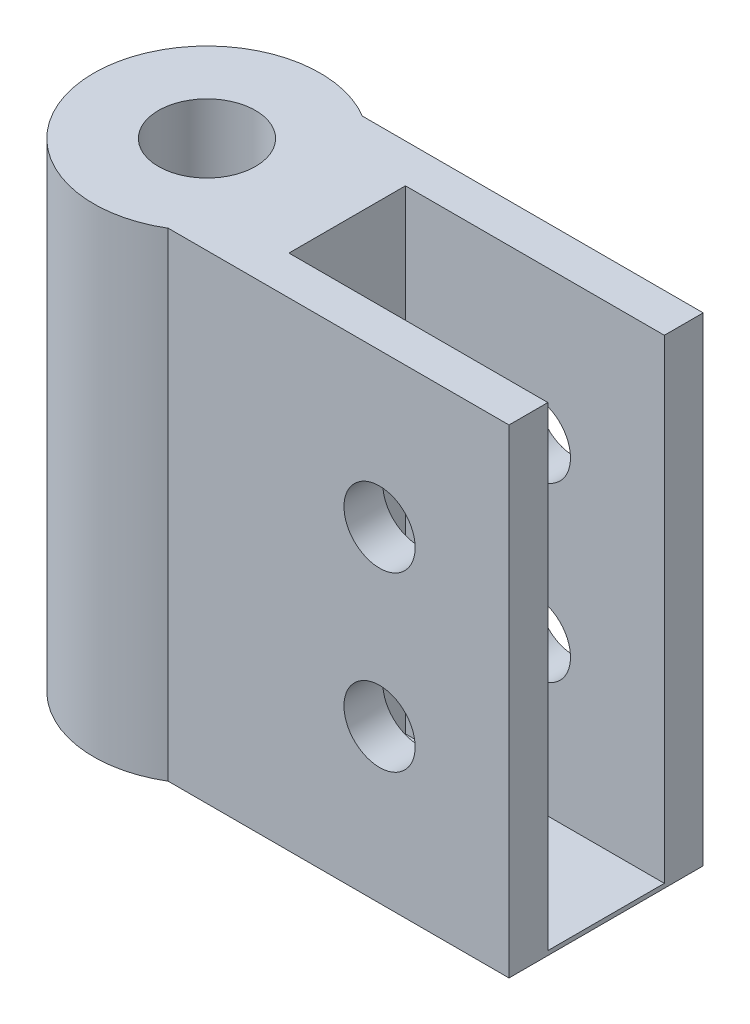
ISO-10303-21;
HEADER;
FILE_DESCRIPTION(('STEP AP214'),'2;1');
FILE_NAME('part.step','',(''),(''),'','','');
FILE_SCHEMA(('AUTOMOTIVE_DESIGN { 1 0 10303 214 1 1 1 1 }'));
ENDSEC;
DATA;
#1=APPLICATION_CONTEXT('core data for automotive mechanical design processes');
#2=APPLICATION_PROTOCOL_DEFINITION('international standard','automotive_design',2000,#1);
#3=PRODUCT_CONTEXT('',#1,'mechanical');
#4=PRODUCT('Part','Part','',(#3));
#5=PRODUCT_RELATED_PRODUCT_CATEGORY('part','',(#4));
#6=PRODUCT_DEFINITION_FORMATION('','',#4);
#7=PRODUCT_DEFINITION_CONTEXT('part definition',#1,'design');
#8=PRODUCT_DEFINITION('design','',#6,#7);
#9=PRODUCT_DEFINITION_SHAPE('','',#8);
#10=(LENGTH_UNIT() NAMED_UNIT(*) SI_UNIT(.MILLI.,.METRE.));
#11=(NAMED_UNIT(*) PLANE_ANGLE_UNIT() SI_UNIT($,.RADIAN.));
#12=(NAMED_UNIT(*) SI_UNIT($,.STERADIAN.) SOLID_ANGLE_UNIT());
#13=UNCERTAINTY_MEASURE_WITH_UNIT(LENGTH_MEASURE(1.E-05),#10,'distance_accuracy_value','');
#14=(GEOMETRIC_REPRESENTATION_CONTEXT(3) GLOBAL_UNCERTAINTY_ASSIGNED_CONTEXT((#13)) GLOBAL_UNIT_ASSIGNED_CONTEXT((#10,
#11,#12)) REPRESENTATION_CONTEXT('',''));
#15=CARTESIAN_POINT('',(0.,0.,0.));
#16=DIRECTION('',(0.,0.,1.));
#17=DIRECTION('',(1.,0.,0.));
#18=AXIS2_PLACEMENT_3D('',#15,#16,#17);
#19=CARTESIAN_POINT('',(0.,22.2,0.));
#20=DIRECTION('',(0.,1.,0.));
#21=DIRECTION('',(0.,0.,1.));
#22=AXIS2_PLACEMENT_3D('',#19,#20,#21);
#23=PLANE('',#22);
#24=DIRECTION('',(1.,0.,0.));
#25=VECTOR('',#24,1.);
#26=CARTESIAN_POINT('',(6.5,22.2,2.7));
#27=LINE('',#26,#25);
#28=CARTESIAN_POINT('',(6.5,22.2,2.7));
#29=VERTEX_POINT('',#28);
#30=CARTESIAN_POINT('',(18.5,22.2,2.7));
#31=VERTEX_POINT('',#30);
#32=EDGE_CURVE('E121',#29,#31,#27,.T.);
#33=ORIENTED_EDGE('',*,*,#32,.F.);
#34=DIRECTION('',(0.,0.,1.));
#35=VECTOR('',#34,1.);
#36=CARTESIAN_POINT('',(6.5,22.2,2.7));
#37=LINE('',#36,#35);
#38=CARTESIAN_POINT('',(6.5,22.2,-2.7));
#39=VERTEX_POINT('',#38);
#40=EDGE_CURVE('E192',#39,#29,#37,.T.);
#41=ORIENTED_EDGE('',*,*,#40,.F.);
#42=DIRECTION('',(-1.,0.,0.));
#43=VECTOR('',#42,1.);
#44=CARTESIAN_POINT('',(6.5,22.2,-2.7));
#45=LINE('',#44,#43);
#46=CARTESIAN_POINT('',(18.5,22.2,-2.7));
#47=VERTEX_POINT('',#46);
#48=EDGE_CURVE('E188',#47,#39,#45,.T.);
#49=ORIENTED_EDGE('',*,*,#48,.F.);
#50=DIRECTION('',(0.,0.,-1.));
#51=VECTOR('',#50,1.);
#52=CARTESIAN_POINT('',(18.5,22.2,4.5));
#53=LINE('',#52,#51);
#54=CARTESIAN_POINT('',(18.5,22.2,-4.5));
#55=VERTEX_POINT('',#54);
#56=EDGE_CURVE('E126',#47,#55,#53,.T.);
#57=ORIENTED_EDGE('',*,*,#56,.T.);
#58=DIRECTION('',(-1.,0.,0.));
#59=VECTOR('',#58,1.);
#60=CARTESIAN_POINT('',(18.5,22.2,-4.5));
#61=LINE('',#60,#59);
#62=CARTESIAN_POINT('',(2.70416345659799,22.2,-4.5));
#63=VERTEX_POINT('',#62);
#64=EDGE_CURVE('E145',#55,#63,#61,.T.);
#65=ORIENTED_EDGE('',*,*,#64,.T.);
#66=CARTESIAN_POINT('',(0.,22.2,0.));
#67=DIRECTION('',(0.,1.,0.));
#68=DIRECTION('',(0.,0.,1.));
#69=AXIS2_PLACEMENT_3D('',#66,#67,#68);
#70=CIRCLE('',#69,5.25);
#71=CARTESIAN_POINT('',(2.70416345659799,22.2,4.5));
#72=VERTEX_POINT('',#71);
#73=EDGE_CURVE('E160',#63,#72,#70,.T.);
#74=ORIENTED_EDGE('',*,*,#73,.T.);
#75=DIRECTION('',(1.,0.,0.));
#76=VECTOR('',#75,1.);
#77=CARTESIAN_POINT('',(18.5,22.2,4.5));
#78=LINE('',#77,#76);
#79=CARTESIAN_POINT('',(18.5,22.2,4.5));
#80=VERTEX_POINT('',#79);
#81=EDGE_CURVE('E139',#72,#80,#78,.T.);
#82=ORIENTED_EDGE('',*,*,#81,.T.);
#83=EDGE_CURVE('E142',#80,#31,#53,.T.);
#84=ORIENTED_EDGE('',*,*,#83,.T.);
#85=EDGE_LOOP('',(#33,#41,#49,#57,#65,#74,#82,#84));
#86=FACE_BOUND('',#85,.T.);
#87=CARTESIAN_POINT('',(0.,22.2,0.));
#88=DIRECTION('',(0.,1.,0.));
#89=DIRECTION('',(0.,0.,1.));
#90=AXIS2_PLACEMENT_3D('',#87,#88,#89);
#91=CIRCLE('',#90,2.25);
#92=CARTESIAN_POINT('',(0.,22.2,2.25));
#93=VERTEX_POINT('',#92);
#94=EDGE_CURVE('E155',#93,#93,#91,.T.);
#95=ORIENTED_EDGE('',*,*,#94,.F.);
#96=EDGE_LOOP('',(#95));
#97=FACE_BOUND('',#96,.T.);
#98=ADVANCED_FACE('F39',(#86,#97),#23,.T.);
#99=CARTESIAN_POINT('',(0.,0.,0.));
#100=DIRECTION('',(0.,1.,0.));
#101=DIRECTION('',(0.,0.,1.));
#102=AXIS2_PLACEMENT_3D('',#99,#100,#101);
#103=PLANE('',#102);
#104=CARTESIAN_POINT('',(0.,0.,0.));
#105=DIRECTION('',(0.,1.,0.));
#106=DIRECTION('',(0.,0.,1.));
#107=AXIS2_PLACEMENT_3D('',#104,#105,#106);
#108=CIRCLE('',#107,5.25);
#109=CARTESIAN_POINT('',(2.70416345659799,0.,-4.5));
#110=VERTEX_POINT('',#109);
#111=CARTESIAN_POINT('',(2.70416345659799,0.,4.5));
#112=VERTEX_POINT('',#111);
#113=EDGE_CURVE('E63',#110,#112,#108,.T.);
#114=ORIENTED_EDGE('',*,*,#113,.F.);
#115=DIRECTION('',(1.,0.,0.));
#116=VECTOR('',#115,1.);
#117=CARTESIAN_POINT('',(18.5,0.,-4.5));
#118=LINE('',#117,#116);
#119=CARTESIAN_POINT('',(18.5,0.,-4.5));
#120=VERTEX_POINT('',#119);
#121=EDGE_CURVE('E135',#110,#120,#118,.T.);
#122=ORIENTED_EDGE('',*,*,#121,.T.);
#123=DIRECTION('',(0.,0.,1.));
#124=VECTOR('',#123,1.);
#125=CARTESIAN_POINT('',(18.5,0.,4.5));
#126=LINE('',#125,#124);
#127=CARTESIAN_POINT('',(18.5,0.,4.5));
#128=VERTEX_POINT('',#127);
#129=EDGE_CURVE('E133',#120,#128,#126,.T.);
#130=ORIENTED_EDGE('',*,*,#129,.T.);
#131=DIRECTION('',(-1.,0.,0.));
#132=VECTOR('',#131,1.);
#133=CARTESIAN_POINT('',(18.5,0.,4.5));
#134=LINE('',#133,#132);
#135=EDGE_CURVE('E138',#128,#112,#134,.T.);
#136=ORIENTED_EDGE('',*,*,#135,.T.);
#137=EDGE_LOOP('',(#114,#122,#130,#136));
#138=FACE_BOUND('',#137,.T.);
#139=CARTESIAN_POINT('',(0.,0.,0.));
#140=DIRECTION('',(0.,1.,0.));
#141=DIRECTION('',(0.,0.,1.));
#142=AXIS2_PLACEMENT_3D('',#139,#140,#141);
#143=CIRCLE('',#142,2.25);
#144=CARTESIAN_POINT('',(0.,0.,2.25));
#145=VERTEX_POINT('',#144);
#146=EDGE_CURVE('E154',#145,#145,#143,.T.);
#147=ORIENTED_EDGE('',*,*,#146,.T.);
#148=EDGE_LOOP('',(#147));
#149=FACE_BOUND('',#148,.T.);
#150=ADVANCED_FACE('F213',(#138,#149),#103,.F.);
#151=CARTESIAN_POINT('',(0.,22.2,0.));
#152=DIRECTION('',(0.,-1.,0.));
#153=DIRECTION('',(0.,0.,-1.));
#154=AXIS2_PLACEMENT_3D('',#151,#152,#153);
#155=CYLINDRICAL_SURFACE('',#154,5.25);
#156=ORIENTED_EDGE('',*,*,#73,.F.);
#157=DIRECTION('',(0.,-1.,0.));
#158=VECTOR('',#157,1.);
#159=CARTESIAN_POINT('',(2.70416345659799,22.2,-4.5));
#160=LINE('',#159,#158);
#161=EDGE_CURVE('E11',#63,#110,#160,.T.);
#162=ORIENTED_EDGE('',*,*,#161,.T.);
#163=ORIENTED_EDGE('',*,*,#113,.T.);
#164=DIRECTION('',(0.,-1.,0.));
#165=VECTOR('',#164,1.);
#166=CARTESIAN_POINT('',(2.70416345659799,22.2,4.5));
#167=LINE('',#166,#165);
#168=EDGE_CURVE('E48',#112,#72,#167,.F.);
#169=ORIENTED_EDGE('',*,*,#168,.T.);
#170=EDGE_LOOP('',(#156,#162,#163,#169));
#171=FACE_BOUND('',#170,.T.);
#172=ADVANCED_FACE('F41',(#171),#155,.T.);
#173=CARTESIAN_POINT('',(0.,22.2,0.));
#174=DIRECTION('',(0.,-1.,0.));
#175=DIRECTION('',(0.,0.,-1.));
#176=AXIS2_PLACEMENT_3D('',#173,#174,#175);
#177=CYLINDRICAL_SURFACE('',#176,2.25);
#178=ORIENTED_EDGE('',*,*,#94,.T.);
#179=EDGE_LOOP('',(#178));
#180=FACE_BOUND('',#179,.T.);
#181=ORIENTED_EDGE('',*,*,#146,.F.);
#182=EDGE_LOOP('',(#181));
#183=FACE_BOUND('',#182,.T.);
#184=ADVANCED_FACE('F221',(#180,#183),#177,.F.);
#185=CARTESIAN_POINT('',(18.5,-18.3575597506858,-4.5));
#186=DIRECTION('',(0.,0.,-1.));
#187=DIRECTION('',(-1.,0.,0.));
#188=AXIS2_PLACEMENT_3D('',#185,#186,#187);
#189=PLANE('',#188);
#190=CARTESIAN_POINT('',(12.5,15.1,-4.5));
#191=DIRECTION('',(0.,0.,-1.));
#192=DIRECTION('',(-1.,0.,0.));
#193=AXIS2_PLACEMENT_3D('',#190,#191,#192);
#194=CIRCLE('',#193,1.65);
#195=CARTESIAN_POINT('',(10.85,15.1,-4.5));
#196=VERTEX_POINT('',#195);
#197=EDGE_CURVE('E186',#196,#196,#194,.T.);
#198=ORIENTED_EDGE('',*,*,#197,.F.);
#199=EDGE_LOOP('',(#198));
#200=FACE_BOUND('',#199,.T.);
#201=CARTESIAN_POINT('',(12.5,7.1,-4.5));
#202=DIRECTION('',(0.,0.,-1.));
#203=DIRECTION('',(-1.,0.,0.));
#204=AXIS2_PLACEMENT_3D('',#201,#202,#203);
#205=CIRCLE('',#204,1.65);
#206=CARTESIAN_POINT('',(10.85,7.1,-4.5));
#207=VERTEX_POINT('',#206);
#208=EDGE_CURVE('E171',#207,#207,#205,.T.);
#209=ORIENTED_EDGE('',*,*,#208,.F.);
#210=EDGE_LOOP('',(#209));
#211=FACE_BOUND('',#210,.T.);
#212=ORIENTED_EDGE('',*,*,#161,.F.);
#213=ORIENTED_EDGE('',*,*,#64,.F.);
#214=DIRECTION('',(0.,1.,0.));
#215=VECTOR('',#214,1.);
#216=CARTESIAN_POINT('',(18.5,-18.3575597506858,-4.5));
#217=LINE('',#216,#215);
#218=EDGE_CURVE('E136',#120,#55,#217,.T.);
#219=ORIENTED_EDGE('',*,*,#218,.F.);
#220=ORIENTED_EDGE('',*,*,#121,.F.);
#221=EDGE_LOOP('',(#212,#213,#219,#220));
#222=FACE_BOUND('',#221,.T.);
#223=ADVANCED_FACE('F218',(#200,#211,#222),#189,.T.);
#224=CARTESIAN_POINT('',(18.5,-18.3575597506858,4.5));
#225=DIRECTION('',(0.,0.,1.));
#226=DIRECTION('',(1.,0.,0.));
#227=AXIS2_PLACEMENT_3D('',#224,#225,#226);
#228=PLANE('',#227);
#229=CARTESIAN_POINT('',(12.5,15.1,4.5));
#230=DIRECTION('',(0.,0.,1.));
#231=DIRECTION('',(1.,0.,0.));
#232=AXIS2_PLACEMENT_3D('',#229,#230,#231);
#233=CIRCLE('',#232,1.65);
#234=CARTESIAN_POINT('',(14.15,15.1,4.5));
#235=VERTEX_POINT('',#234);
#236=EDGE_CURVE('E167',#235,#235,#233,.T.);
#237=ORIENTED_EDGE('',*,*,#236,.F.);
#238=EDGE_LOOP('',(#237));
#239=FACE_BOUND('',#238,.T.);
#240=CARTESIAN_POINT('',(12.5,7.1,4.5));
#241=DIRECTION('',(0.,0.,1.));
#242=DIRECTION('',(-1.,0.,0.));
#243=AXIS2_PLACEMENT_3D('',#240,#241,#242);
#244=CIRCLE('',#243,1.65);
#245=CARTESIAN_POINT('',(10.85,7.1,4.5));
#246=VERTEX_POINT('',#245);
#247=EDGE_CURVE('E174',#246,#246,#244,.T.);
#248=ORIENTED_EDGE('',*,*,#247,.F.);
#249=EDGE_LOOP('',(#248));
#250=FACE_BOUND('',#249,.T.);
#251=ORIENTED_EDGE('',*,*,#168,.F.);
#252=ORIENTED_EDGE('',*,*,#135,.F.);
#253=DIRECTION('',(0.,1.,0.));
#254=VECTOR('',#253,1.);
#255=CARTESIAN_POINT('',(18.5,-18.3575597506858,4.5));
#256=LINE('',#255,#254);
#257=EDGE_CURVE('E148',#128,#80,#256,.T.);
#258=ORIENTED_EDGE('',*,*,#257,.T.);
#259=ORIENTED_EDGE('',*,*,#81,.F.);
#260=EDGE_LOOP('',(#251,#252,#258,#259));
#261=FACE_BOUND('',#260,.T.);
#262=ADVANCED_FACE('F211',(#239,#250,#261),#228,.T.);
#263=CARTESIAN_POINT('',(18.5,-18.3575597506858,4.5));
#264=DIRECTION('',(1.,0.,0.));
#265=DIRECTION('',(0.,0.,-1.));
#266=AXIS2_PLACEMENT_3D('',#263,#264,#265);
#267=PLANE('',#266);
#268=DIRECTION('',(0.,1.,0.));
#269=VECTOR('',#268,1.);
#270=CARTESIAN_POINT('',(18.5,0.200000000000002,2.7));
#271=LINE('',#270,#269);
#272=CARTESIAN_POINT('',(18.5,0.200000000000002,2.7));
#273=VERTEX_POINT('',#272);
#274=EDGE_CURVE('E141',#273,#31,#271,.T.);
#275=ORIENTED_EDGE('',*,*,#274,.T.);
#276=ORIENTED_EDGE('',*,*,#83,.F.);
#277=ORIENTED_EDGE('',*,*,#257,.F.);
#278=ORIENTED_EDGE('',*,*,#129,.F.);
#279=ORIENTED_EDGE('',*,*,#218,.T.);
#280=ORIENTED_EDGE('',*,*,#56,.F.);
#281=DIRECTION('',(0.,1.,0.));
#282=VECTOR('',#281,1.);
#283=CARTESIAN_POINT('',(18.5,0.200000000000002,-2.7));
#284=LINE('',#283,#282);
#285=CARTESIAN_POINT('',(18.5,0.200000000000002,-2.7));
#286=VERTEX_POINT('',#285);
#287=EDGE_CURVE('E110',#286,#47,#284,.T.);
#288=ORIENTED_EDGE('',*,*,#287,.F.);
#289=DIRECTION('',(0.,0.,-1.));
#290=VECTOR('',#289,1.);
#291=CARTESIAN_POINT('',(18.5,0.200000000000002,2.7));
#292=LINE('',#291,#290);
#293=EDGE_CURVE('E115',#273,#286,#292,.T.);
#294=ORIENTED_EDGE('',*,*,#293,.F.);
#295=EDGE_LOOP('',(#275,#276,#277,#278,#279,#280,#288,#294));
#296=FACE_BOUND('',#295,.T.);
#297=ADVANCED_FACE('F124',(#296),#267,.T.);
#298=CARTESIAN_POINT('',(6.5,0.200000000000002,2.7));
#299=DIRECTION('',(0.,0.,1.));
#300=DIRECTION('',(1.,0.,0.));
#301=AXIS2_PLACEMENT_3D('',#298,#299,#300);
#302=PLANE('',#301);
#303=CARTESIAN_POINT('',(12.5,15.1,2.7));
#304=DIRECTION('',(0.,0.,1.));
#305=DIRECTION('',(1.,0.,0.));
#306=AXIS2_PLACEMENT_3D('',#303,#304,#305);
#307=CIRCLE('',#306,1.65);
#308=CARTESIAN_POINT('',(14.15,15.1,2.7));
#309=VERTEX_POINT('',#308);
#310=EDGE_CURVE('E183',#309,#309,#307,.T.);
#311=ORIENTED_EDGE('',*,*,#310,.T.);
#312=EDGE_LOOP('',(#311));
#313=FACE_BOUND('',#312,.T.);
#314=CARTESIAN_POINT('',(12.5,7.1,2.7));
#315=DIRECTION('',(0.,0.,1.));
#316=DIRECTION('',(1.,0.,0.));
#317=AXIS2_PLACEMENT_3D('',#314,#315,#316);
#318=CIRCLE('',#317,1.65);
#319=CARTESIAN_POINT('',(14.15,7.1,2.7));
#320=VERTEX_POINT('',#319);
#321=EDGE_CURVE('E166',#320,#320,#318,.T.);
#322=ORIENTED_EDGE('',*,*,#321,.T.);
#323=EDGE_LOOP('',(#322));
#324=FACE_BOUND('',#323,.T.);
#325=ORIENTED_EDGE('',*,*,#32,.T.);
#326=ORIENTED_EDGE('',*,*,#274,.F.);
#327=DIRECTION('',(1.,0.,0.));
#328=VECTOR('',#327,1.);
#329=CARTESIAN_POINT('',(6.5,0.200000000000002,2.7));
#330=LINE('',#329,#328);
#331=CARTESIAN_POINT('',(6.5,0.200000000000002,2.7));
#332=VERTEX_POINT('',#331);
#333=EDGE_CURVE('E56',#332,#273,#330,.T.);
#334=ORIENTED_EDGE('',*,*,#333,.F.);
#335=DIRECTION('',(0.,1.,0.));
#336=VECTOR('',#335,1.);
#337=CARTESIAN_POINT('',(6.5,0.200000000000002,2.7));
#338=LINE('',#337,#336);
#339=EDGE_CURVE('E128',#332,#29,#338,.T.);
#340=ORIENTED_EDGE('',*,*,#339,.T.);
#341=EDGE_LOOP('',(#325,#326,#334,#340));
#342=FACE_BOUND('',#341,.T.);
#343=ADVANCED_FACE('F197',(#313,#324,#342),#302,.F.);
#344=CARTESIAN_POINT('',(6.5,0.200000000000002,2.7));
#345=DIRECTION('',(-1.,0.,0.));
#346=DIRECTION('',(0.,0.,1.));
#347=AXIS2_PLACEMENT_3D('',#344,#345,#346);
#348=PLANE('',#347);
#349=ORIENTED_EDGE('',*,*,#40,.T.);
#350=ORIENTED_EDGE('',*,*,#339,.F.);
#351=DIRECTION('',(0.,0.,1.));
#352=VECTOR('',#351,1.);
#353=CARTESIAN_POINT('',(6.5,0.200000000000002,2.7));
#354=LINE('',#353,#352);
#355=CARTESIAN_POINT('',(6.5,0.200000000000002,-2.7));
#356=VERTEX_POINT('',#355);
#357=EDGE_CURVE('E114',#356,#332,#354,.T.);
#358=ORIENTED_EDGE('',*,*,#357,.F.);
#359=DIRECTION('',(0.,1.,0.));
#360=VECTOR('',#359,1.);
#361=CARTESIAN_POINT('',(6.5,0.200000000000002,-2.7));
#362=LINE('',#361,#360);
#363=EDGE_CURVE('E112',#356,#39,#362,.T.);
#364=ORIENTED_EDGE('',*,*,#363,.T.);
#365=EDGE_LOOP('',(#349,#350,#358,#364));
#366=FACE_BOUND('',#365,.T.);
#367=ADVANCED_FACE('F201',(#366),#348,.F.);
#368=CARTESIAN_POINT('',(6.5,0.200000000000002,-2.7));
#369=DIRECTION('',(0.,0.,-1.));
#370=DIRECTION('',(-1.,0.,0.));
#371=AXIS2_PLACEMENT_3D('',#368,#369,#370);
#372=PLANE('',#371);
#373=CARTESIAN_POINT('',(12.5,15.1,-2.7));
#374=DIRECTION('',(0.,0.,-1.));
#375=DIRECTION('',(-1.,0.,0.));
#376=AXIS2_PLACEMENT_3D('',#373,#374,#375);
#377=CIRCLE('',#376,1.65);
#378=CARTESIAN_POINT('',(10.85,15.1,-2.7));
#379=VERTEX_POINT('',#378);
#380=EDGE_CURVE('E43',#379,#379,#377,.T.);
#381=ORIENTED_EDGE('',*,*,#380,.T.);
#382=EDGE_LOOP('',(#381));
#383=FACE_BOUND('',#382,.T.);
#384=CARTESIAN_POINT('',(12.5,7.1,-2.7));
#385=DIRECTION('',(0.,0.,-1.));
#386=DIRECTION('',(-1.,0.,0.));
#387=AXIS2_PLACEMENT_3D('',#384,#385,#386);
#388=CIRCLE('',#387,1.65);
#389=CARTESIAN_POINT('',(10.85,7.1,-2.7));
#390=VERTEX_POINT('',#389);
#391=EDGE_CURVE('E164',#390,#390,#388,.T.);
#392=ORIENTED_EDGE('',*,*,#391,.T.);
#393=EDGE_LOOP('',(#392));
#394=FACE_BOUND('',#393,.T.);
#395=ORIENTED_EDGE('',*,*,#48,.T.);
#396=ORIENTED_EDGE('',*,*,#363,.F.);
#397=DIRECTION('',(-1.,0.,0.));
#398=VECTOR('',#397,1.);
#399=CARTESIAN_POINT('',(6.5,0.200000000000002,-2.7));
#400=LINE('',#399,#398);
#401=EDGE_CURVE('E106',#286,#356,#400,.T.);
#402=ORIENTED_EDGE('',*,*,#401,.F.);
#403=ORIENTED_EDGE('',*,*,#287,.T.);
#404=EDGE_LOOP('',(#395,#396,#402,#403));
#405=FACE_BOUND('',#404,.T.);
#406=ADVANCED_FACE('F108',(#383,#394,#405),#372,.F.);
#407=CARTESIAN_POINT('',(0.,0.200000000000002,0.));
#408=DIRECTION('',(0.,-1.,0.));
#409=DIRECTION('',(0.,0.,-1.));
#410=AXIS2_PLACEMENT_3D('',#407,#408,#409);
#411=PLANE('',#410);
#412=ORIENTED_EDGE('',*,*,#293,.T.);
#413=ORIENTED_EDGE('',*,*,#401,.T.);
#414=ORIENTED_EDGE('',*,*,#357,.T.);
#415=ORIENTED_EDGE('',*,*,#333,.T.);
#416=EDGE_LOOP('',(#412,#413,#414,#415));
#417=FACE_BOUND('',#416,.T.);
#418=ADVANCED_FACE('F118',(#417),#411,.F.);
#419=CARTESIAN_POINT('',(12.5,7.1,-17.5));
#420=DIRECTION('',(0.,0.,1.));
#421=DIRECTION('',(1.,0.,0.));
#422=AXIS2_PLACEMENT_3D('',#419,#420,#421);
#423=CYLINDRICAL_SURFACE('',#422,1.65);
#424=ORIENTED_EDGE('',*,*,#208,.T.);
#425=EDGE_LOOP('',(#424));
#426=FACE_BOUND('',#425,.T.);
#427=ORIENTED_EDGE('',*,*,#391,.F.);
#428=EDGE_LOOP('',(#427));
#429=FACE_BOUND('',#428,.T.);
#430=ADVANCED_FACE('F251',(#426,#429),#423,.F.);
#431=CARTESIAN_POINT('',(12.5,15.1,-17.5));
#432=DIRECTION('',(0.,0.,1.));
#433=DIRECTION('',(1.,0.,0.));
#434=AXIS2_PLACEMENT_3D('',#431,#432,#433);
#435=CYLINDRICAL_SURFACE('',#434,1.65);
#436=ORIENTED_EDGE('',*,*,#197,.T.);
#437=EDGE_LOOP('',(#436));
#438=FACE_BOUND('',#437,.T.);
#439=ORIENTED_EDGE('',*,*,#380,.F.);
#440=EDGE_LOOP('',(#439));
#441=FACE_BOUND('',#440,.T.);
#442=ADVANCED_FACE('F256',(#438,#441),#435,.F.);
#443=ORIENTED_EDGE('',*,*,#247,.T.);
#444=EDGE_LOOP('',(#443));
#445=FACE_BOUND('',#444,.T.);
#446=ORIENTED_EDGE('',*,*,#321,.F.);
#447=EDGE_LOOP('',(#446));
#448=FACE_BOUND('',#447,.T.);
#449=ADVANCED_FACE('F252',(#445,#448),#423,.F.);
#450=ORIENTED_EDGE('',*,*,#236,.T.);
#451=EDGE_LOOP('',(#450));
#452=FACE_BOUND('',#451,.T.);
#453=ORIENTED_EDGE('',*,*,#310,.F.);
#454=EDGE_LOOP('',(#453));
#455=FACE_BOUND('',#454,.T.);
#456=ADVANCED_FACE('F255',(#452,#455),#435,.F.);
#457=CLOSED_SHELL('',(#98,#150,#172,#184,#223,#262,#297,#343,#367,#406,#418,#430,#442,#449,#456));
#458=MANIFOLD_SOLID_BREP('B2',#457);
#459=ADVANCED_BREP_SHAPE_REPRESENTATION('',(#18,#458),#14);
#460=SHAPE_DEFINITION_REPRESENTATION(#9,#459);
ENDSEC;
END-ISO-10303-21;
